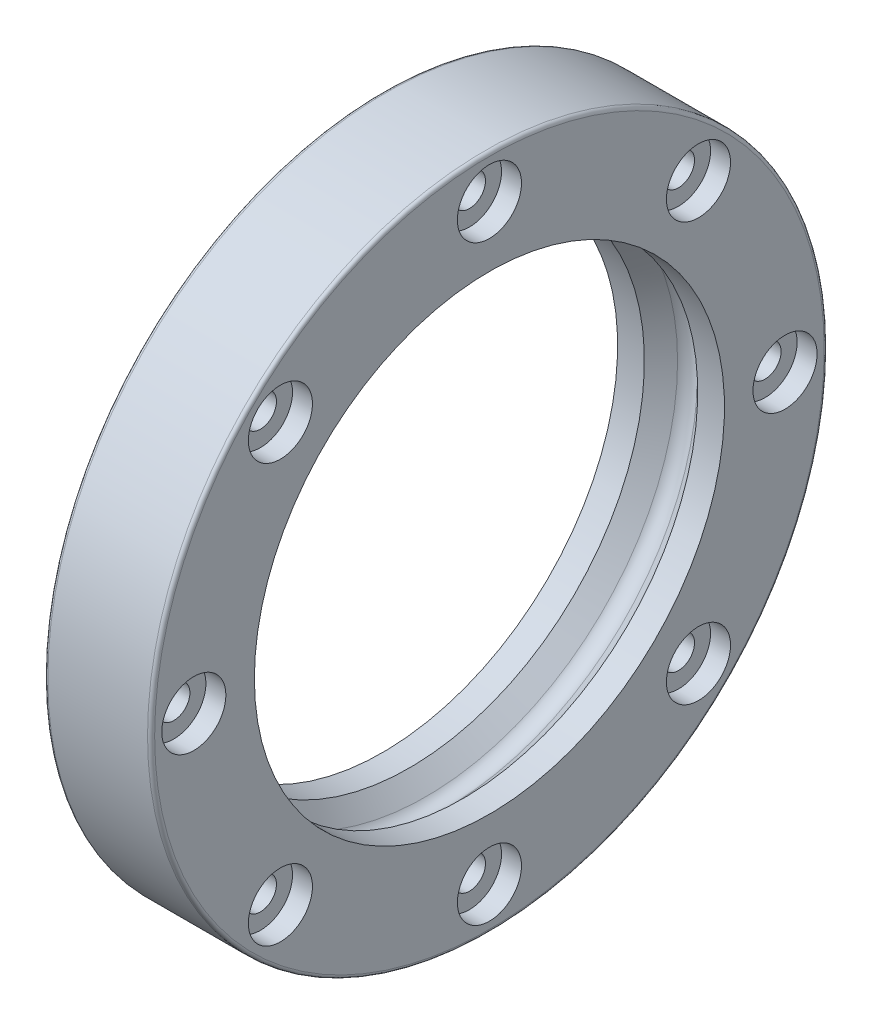
ISO-10303-21;
HEADER;
FILE_DESCRIPTION(('STEP AP214'),'2;1');
FILE_NAME('part.step','',(''),(''),'','','');
FILE_SCHEMA(('AUTOMOTIVE_DESIGN { 1 0 10303 214 1 1 1 1 }'));
ENDSEC;
DATA;
#1=APPLICATION_CONTEXT('core data for automotive mechanical design processes');
#2=APPLICATION_PROTOCOL_DEFINITION('international standard','automotive_design',2000,#1);
#3=PRODUCT_CONTEXT('',#1,'mechanical');
#4=PRODUCT('Part','Part','',(#3));
#5=PRODUCT_RELATED_PRODUCT_CATEGORY('part','',(#4));
#6=PRODUCT_DEFINITION_FORMATION('','',#4);
#7=PRODUCT_DEFINITION_CONTEXT('part definition',#1,'design');
#8=PRODUCT_DEFINITION('design','',#6,#7);
#9=PRODUCT_DEFINITION_SHAPE('','',#8);
#10=(LENGTH_UNIT() NAMED_UNIT(*) SI_UNIT(.MILLI.,.METRE.));
#11=(NAMED_UNIT(*) PLANE_ANGLE_UNIT() SI_UNIT($,.RADIAN.));
#12=(NAMED_UNIT(*) SI_UNIT($,.STERADIAN.) SOLID_ANGLE_UNIT());
#13=UNCERTAINTY_MEASURE_WITH_UNIT(LENGTH_MEASURE(1.E-05),#10,'distance_accuracy_value','');
#14=(GEOMETRIC_REPRESENTATION_CONTEXT(3) GLOBAL_UNCERTAINTY_ASSIGNED_CONTEXT((#13)) GLOBAL_UNIT_ASSIGNED_CONTEXT((#10,
#11,#12)) REPRESENTATION_CONTEXT('',''));
#15=CARTESIAN_POINT('',(0.,0.,0.));
#16=DIRECTION('',(0.,0.,1.));
#17=DIRECTION('',(1.,0.,0.));
#18=AXIS2_PLACEMENT_3D('',#15,#16,#17);
#19=CARTESIAN_POINT('',(0.,0.,0.));
#20=DIRECTION('',(1.,0.,0.));
#21=DIRECTION('',(0.,0.,-1.));
#22=AXIS2_PLACEMENT_3D('',#19,#20,#21);
#23=CONICAL_SURFACE('',#22,36.7426406871193,0.785398163397447);
#24=CARTESIAN_POINT('',(-1.4142135623731,0.,0.));
#25=DIRECTION('',(-1.,0.,0.));
#26=DIRECTION('',(0.,0.,1.));
#27=AXIS2_PLACEMENT_3D('',#24,#25,#26);
#28=CIRCLE('',#27,35.3284271247462);
#29=CARTESIAN_POINT('',(-1.4142135623731,0.,35.3284271247462));
#30=VERTEX_POINT('',#29);
#31=EDGE_CURVE('E54',#30,#30,#28,.F.);
#32=ORIENTED_EDGE('',*,*,#31,.T.);
#33=EDGE_LOOP('',(#32));
#34=FACE_BOUND('',#33,.T.);
#35=CARTESIAN_POINT('',(-3.74264068711929,0.,0.));
#36=DIRECTION('',(-1.,0.,0.));
#37=DIRECTION('',(0.,0.,1.));
#38=AXIS2_PLACEMENT_3D('',#35,#36,#37);
#39=CIRCLE('',#38,33.);
#40=CARTESIAN_POINT('',(-3.74264068711929,0.,33.));
#41=VERTEX_POINT('',#40);
#42=EDGE_CURVE('E69',#41,#41,#39,.T.);
#43=ORIENTED_EDGE('',*,*,#42,.T.);
#44=EDGE_LOOP('',(#43));
#45=FACE_BOUND('',#44,.T.);
#46=ADVANCED_FACE('F34',(#34,#45),#23,.F.);
#47=CARTESIAN_POINT('',(0.,0.,0.));
#48=DIRECTION('',(-1.,0.,0.));
#49=DIRECTION('',(0.,0.,1.));
#50=AXIS2_PLACEMENT_3D('',#47,#48,#49);
#51=CONICAL_SURFACE('',#50,36.7426406871193,0.785398163397449);
#52=CARTESIAN_POINT('',(1.4142135623731,0.,0.));
#53=DIRECTION('',(1.,0.,0.));
#54=DIRECTION('',(0.,0.,-1.));
#55=AXIS2_PLACEMENT_3D('',#52,#53,#54);
#56=CIRCLE('',#55,35.3284271247462);
#57=CARTESIAN_POINT('',(1.4142135623731,0.,-35.3284271247462));
#58=VERTEX_POINT('',#57);
#59=EDGE_CURVE('E57',#58,#58,#56,.F.);
#60=ORIENTED_EDGE('',*,*,#59,.T.);
#61=EDGE_LOOP('',(#60));
#62=FACE_BOUND('',#61,.T.);
#63=CARTESIAN_POINT('',(3.74264068711929,0.,0.));
#64=DIRECTION('',(-1.,0.,0.));
#65=DIRECTION('',(0.,0.,1.));
#66=AXIS2_PLACEMENT_3D('',#63,#64,#65);
#67=CIRCLE('',#66,33.);
#68=CARTESIAN_POINT('',(3.74264068711929,0.,33.));
#69=VERTEX_POINT('',#68);
#70=EDGE_CURVE('E60',#69,#69,#67,.T.);
#71=ORIENTED_EDGE('',*,*,#70,.F.);
#72=EDGE_LOOP('',(#71));
#73=FACE_BOUND('',#72,.T.);
#74=ADVANCED_FACE('F194',(#62,#73),#51,.F.);
#75=CARTESIAN_POINT('',(-33.7322419359837,0.,0.));
#76=DIRECTION('',(-1.,0.,0.));
#77=DIRECTION('',(0.,0.,1.));
#78=AXIS2_PLACEMENT_3D('',#75,#76,#77);
#79=CYLINDRICAL_SURFACE('',#78,33.);
#80=ORIENTED_EDGE('',*,*,#70,.T.);
#81=EDGE_LOOP('',(#80));
#82=FACE_BOUND('',#81,.T.);
#83=CARTESIAN_POINT('',(7.5,0.,0.));
#84=DIRECTION('',(-1.,0.,0.));
#85=DIRECTION('',(0.,0.,1.));
#86=AXIS2_PLACEMENT_3D('',#83,#84,#85);
#87=CIRCLE('',#86,33.);
#88=CARTESIAN_POINT('',(7.5,0.,33.));
#89=VERTEX_POINT('',#88);
#90=EDGE_CURVE('E63',#89,#89,#87,.T.);
#91=ORIENTED_EDGE('',*,*,#90,.F.);
#92=EDGE_LOOP('',(#91));
#93=FACE_BOUND('',#92,.T.);
#94=ADVANCED_FACE('F175',(#82,#93),#79,.F.);
#95=CARTESIAN_POINT('',(7.5,0.,0.));
#96=DIRECTION('',(1.,0.,0.));
#97=DIRECTION('',(0.,0.,-1.));
#98=AXIS2_PLACEMENT_3D('',#95,#96,#97);
#99=PLANE('',#98);
#100=CARTESIAN_POINT('',(7.5,29.3449314192421,29.3449314192414));
#101=DIRECTION('',(1.,0.,0.));
#102=DIRECTION('',(0.,0.,-1.));
#103=AXIS2_PLACEMENT_3D('',#100,#101,#102);
#104=CIRCLE('',#103,4.5);
#105=CARTESIAN_POINT('',(7.5,29.3449314192421,24.8449314192414));
#106=VERTEX_POINT('',#105);
#107=EDGE_CURVE('E165',#106,#106,#104,.T.);
#108=ORIENTED_EDGE('',*,*,#107,.F.);
#109=EDGE_LOOP('',(#108));
#110=FACE_BOUND('',#109,.T.);
#111=CARTESIAN_POINT('',(7.5,4.3468942668597E-13,41.5));
#112=DIRECTION('',(1.,0.,0.));
#113=DIRECTION('',(0.,0.,-1.));
#114=AXIS2_PLACEMENT_3D('',#111,#112,#113);
#115=CIRCLE('',#114,4.5);
#116=CARTESIAN_POINT('',(7.5,4.3468942668597E-13,37.));
#117=VERTEX_POINT('',#116);
#118=EDGE_CURVE('E153',#117,#117,#115,.T.);
#119=ORIENTED_EDGE('',*,*,#118,.F.);
#120=EDGE_LOOP('',(#119));
#121=FACE_BOUND('',#120,.T.);
#122=CARTESIAN_POINT('',(7.5,-29.3449314192415,29.344931419242));
#123=DIRECTION('',(1.,0.,0.));
#124=DIRECTION('',(0.,0.,-1.));
#125=AXIS2_PLACEMENT_3D('',#122,#123,#124);
#126=CIRCLE('',#125,4.5);
#127=CARTESIAN_POINT('',(7.5,-29.3449314192415,24.844931419242));
#128=VERTEX_POINT('',#127);
#129=EDGE_CURVE('E141',#128,#128,#126,.T.);
#130=ORIENTED_EDGE('',*,*,#129,.F.);
#131=EDGE_LOOP('',(#130));
#132=FACE_BOUND('',#131,.T.);
#133=CARTESIAN_POINT('',(7.5,-41.5,0.));
#134=DIRECTION('',(1.,0.,0.));
#135=DIRECTION('',(0.,0.,-1.));
#136=AXIS2_PLACEMENT_3D('',#133,#134,#135);
#137=CIRCLE('',#136,4.5);
#138=CARTESIAN_POINT('',(7.5,-41.5,-4.5));
#139=VERTEX_POINT('',#138);
#140=EDGE_CURVE('E129',#139,#139,#137,.T.);
#141=ORIENTED_EDGE('',*,*,#140,.F.);
#142=EDGE_LOOP('',(#141));
#143=FACE_BOUND('',#142,.T.);
#144=CARTESIAN_POINT('',(7.5,-29.3449314192419,-29.3449314192416));
#145=DIRECTION('',(1.,0.,0.));
#146=DIRECTION('',(0.,0.,-1.));
#147=AXIS2_PLACEMENT_3D('',#144,#145,#146);
#148=CIRCLE('',#147,4.5);
#149=CARTESIAN_POINT('',(7.5,-29.3449314192419,-33.8449314192416));
#150=VERTEX_POINT('',#149);
#151=EDGE_CURVE('E117',#150,#150,#148,.T.);
#152=ORIENTED_EDGE('',*,*,#151,.F.);
#153=EDGE_LOOP('',(#152));
#154=FACE_BOUND('',#153,.T.);
#155=CARTESIAN_POINT('',(7.5,-1.4489647556199E-13,-41.5));
#156=DIRECTION('',(1.,0.,0.));
#157=DIRECTION('',(0.,0.,-1.));
#158=AXIS2_PLACEMENT_3D('',#155,#156,#157);
#159=CIRCLE('',#158,4.5);
#160=CARTESIAN_POINT('',(7.5,-1.4489647556199E-13,-46.));
#161=VERTEX_POINT('',#160);
#162=EDGE_CURVE('E105',#161,#161,#159,.T.);
#163=ORIENTED_EDGE('',*,*,#162,.F.);
#164=EDGE_LOOP('',(#163));
#165=FACE_BOUND('',#164,.T.);
#166=CARTESIAN_POINT('',(7.5,29.3449314192417,-29.3449314192418));
#167=DIRECTION('',(1.,0.,0.));
#168=DIRECTION('',(0.,0.,-1.));
#169=AXIS2_PLACEMENT_3D('',#166,#167,#168);
#170=CIRCLE('',#169,4.5);
#171=CARTESIAN_POINT('',(7.5,29.3449314192417,-33.8449314192418));
#172=VERTEX_POINT('',#171);
#173=EDGE_CURVE('E93',#172,#172,#170,.T.);
#174=ORIENTED_EDGE('',*,*,#173,.F.);
#175=EDGE_LOOP('',(#174));
#176=FACE_BOUND('',#175,.T.);
#177=CARTESIAN_POINT('',(7.5,41.5,0.));
#178=DIRECTION('',(1.,0.,0.));
#179=DIRECTION('',(0.,0.,-1.));
#180=AXIS2_PLACEMENT_3D('',#177,#178,#179);
#181=CIRCLE('',#180,4.5);
#182=CARTESIAN_POINT('',(7.5,41.5,-4.5));
#183=VERTEX_POINT('',#182);
#184=EDGE_CURVE('E81',#183,#183,#181,.T.);
#185=ORIENTED_EDGE('',*,*,#184,.F.);
#186=EDGE_LOOP('',(#185));
#187=FACE_BOUND('',#186,.T.);
#188=CARTESIAN_POINT('',(7.5,0.,0.));
#189=DIRECTION('',(1.,0.,0.));
#190=DIRECTION('',(0.,0.,-1.));
#191=AXIS2_PLACEMENT_3D('',#188,#189,#190);
#192=CIRCLE('',#191,47.);
#193=CARTESIAN_POINT('',(7.5,0.,-47.));
#194=VERTEX_POINT('',#193);
#195=EDGE_CURVE('E41',#194,#194,#192,.T.);
#196=ORIENTED_EDGE('',*,*,#195,.T.);
#197=EDGE_LOOP('',(#196));
#198=FACE_BOUND('',#197,.T.);
#199=ORIENTED_EDGE('',*,*,#90,.T.);
#200=EDGE_LOOP('',(#199));
#201=FACE_BOUND('',#200,.T.);
#202=ADVANCED_FACE('F171',(#110,#121,#132,#143,#154,#165,#176,#187,#198,#201),#99,.T.);
#203=CARTESIAN_POINT('',(-33.7322419359837,0.,0.));
#204=DIRECTION('',(-1.,0.,0.));
#205=DIRECTION('',(0.,0.,1.));
#206=AXIS2_PLACEMENT_3D('',#203,#204,#205);
#207=CYLINDRICAL_SURFACE('',#206,47.5);
#208=CARTESIAN_POINT('',(7.,0.,0.));
#209=DIRECTION('',(1.,0.,0.));
#210=DIRECTION('',(0.,0.,-1.));
#211=AXIS2_PLACEMENT_3D('',#208,#209,#210);
#212=CIRCLE('',#211,47.5);
#213=CARTESIAN_POINT('',(7.,0.,-47.5));
#214=VERTEX_POINT('',#213);
#215=EDGE_CURVE('E45',#214,#214,#212,.F.);
#216=ORIENTED_EDGE('',*,*,#215,.T.);
#217=EDGE_LOOP('',(#216));
#218=FACE_BOUND('',#217,.T.);
#219=CARTESIAN_POINT('',(-7.,0.,0.));
#220=DIRECTION('',(1.,0.,0.));
#221=DIRECTION('',(0.,0.,-1.));
#222=AXIS2_PLACEMENT_3D('',#219,#220,#221);
#223=CIRCLE('',#222,47.5);
#224=CARTESIAN_POINT('',(-7.,0.,-47.5));
#225=VERTEX_POINT('',#224);
#226=EDGE_CURVE('E49',#225,#225,#223,.T.);
#227=ORIENTED_EDGE('',*,*,#226,.T.);
#228=EDGE_LOOP('',(#227));
#229=FACE_BOUND('',#228,.T.);
#230=ADVANCED_FACE('F174',(#218,#229),#207,.T.);
#231=CARTESIAN_POINT('',(-7.5,0.,0.));
#232=DIRECTION('',(1.,0.,0.));
#233=DIRECTION('',(0.,0.,-1.));
#234=AXIS2_PLACEMENT_3D('',#231,#232,#233);
#235=PLANE('',#234);
#236=CARTESIAN_POINT('',(-7.5,29.3449314192421,29.3449314192414));
#237=DIRECTION('',(1.,0.,0.));
#238=DIRECTION('',(0.,0.,-1.));
#239=AXIS2_PLACEMENT_3D('',#236,#237,#238);
#240=CIRCLE('',#239,2.25);
#241=CARTESIAN_POINT('',(-7.5,29.3449314192421,27.0949314192414));
#242=VERTEX_POINT('',#241);
#243=EDGE_CURVE('E156',#242,#242,#240,.T.);
#244=ORIENTED_EDGE('',*,*,#243,.T.);
#245=EDGE_LOOP('',(#244));
#246=FACE_BOUND('',#245,.T.);
#247=CARTESIAN_POINT('',(-7.5,4.3468942668597E-13,41.5));
#248=DIRECTION('',(1.,0.,0.));
#249=DIRECTION('',(0.,0.,-1.));
#250=AXIS2_PLACEMENT_3D('',#247,#248,#249);
#251=CIRCLE('',#250,2.25);
#252=CARTESIAN_POINT('',(-7.5,4.3468942668597E-13,39.25));
#253=VERTEX_POINT('',#252);
#254=EDGE_CURVE('E144',#253,#253,#251,.T.);
#255=ORIENTED_EDGE('',*,*,#254,.T.);
#256=EDGE_LOOP('',(#255));
#257=FACE_BOUND('',#256,.T.);
#258=CARTESIAN_POINT('',(-7.5,-29.3449314192415,29.344931419242));
#259=DIRECTION('',(1.,0.,0.));
#260=DIRECTION('',(0.,0.,-1.));
#261=AXIS2_PLACEMENT_3D('',#258,#259,#260);
#262=CIRCLE('',#261,2.25);
#263=CARTESIAN_POINT('',(-7.5,-29.3449314192415,27.094931419242));
#264=VERTEX_POINT('',#263);
#265=EDGE_CURVE('E132',#264,#264,#262,.T.);
#266=ORIENTED_EDGE('',*,*,#265,.T.);
#267=EDGE_LOOP('',(#266));
#268=FACE_BOUND('',#267,.T.);
#269=CARTESIAN_POINT('',(-7.5,-41.5,0.));
#270=DIRECTION('',(1.,0.,0.));
#271=DIRECTION('',(0.,0.,-1.));
#272=AXIS2_PLACEMENT_3D('',#269,#270,#271);
#273=CIRCLE('',#272,2.25);
#274=CARTESIAN_POINT('',(-7.5,-41.5,-2.25));
#275=VERTEX_POINT('',#274);
#276=EDGE_CURVE('E120',#275,#275,#273,.T.);
#277=ORIENTED_EDGE('',*,*,#276,.T.);
#278=EDGE_LOOP('',(#277));
#279=FACE_BOUND('',#278,.T.);
#280=CARTESIAN_POINT('',(-7.5,-29.3449314192419,-29.3449314192416));
#281=DIRECTION('',(1.,0.,0.));
#282=DIRECTION('',(0.,0.,-1.));
#283=AXIS2_PLACEMENT_3D('',#280,#281,#282);
#284=CIRCLE('',#283,2.25);
#285=CARTESIAN_POINT('',(-7.5,-29.3449314192419,-31.5949314192416));
#286=VERTEX_POINT('',#285);
#287=EDGE_CURVE('E108',#286,#286,#284,.T.);
#288=ORIENTED_EDGE('',*,*,#287,.T.);
#289=EDGE_LOOP('',(#288));
#290=FACE_BOUND('',#289,.T.);
#291=CARTESIAN_POINT('',(-7.5,-1.4489647556199E-13,-41.5));
#292=DIRECTION('',(1.,0.,0.));
#293=DIRECTION('',(0.,0.,-1.));
#294=AXIS2_PLACEMENT_3D('',#291,#292,#293);
#295=CIRCLE('',#294,2.25);
#296=CARTESIAN_POINT('',(-7.5,-1.4489647556199E-13,-43.75));
#297=VERTEX_POINT('',#296);
#298=EDGE_CURVE('E96',#297,#297,#295,.T.);
#299=ORIENTED_EDGE('',*,*,#298,.T.);
#300=EDGE_LOOP('',(#299));
#301=FACE_BOUND('',#300,.T.);
#302=CARTESIAN_POINT('',(-7.5,29.3449314192417,-29.3449314192418));
#303=DIRECTION('',(1.,0.,0.));
#304=DIRECTION('',(0.,0.,-1.));
#305=AXIS2_PLACEMENT_3D('',#302,#303,#304);
#306=CIRCLE('',#305,2.25);
#307=CARTESIAN_POINT('',(-7.5,29.3449314192417,-31.5949314192418));
#308=VERTEX_POINT('',#307);
#309=EDGE_CURVE('E84',#308,#308,#306,.T.);
#310=ORIENTED_EDGE('',*,*,#309,.T.);
#311=EDGE_LOOP('',(#310));
#312=FACE_BOUND('',#311,.T.);
#313=CARTESIAN_POINT('',(-7.5,41.5,0.));
#314=DIRECTION('',(1.,0.,0.));
#315=DIRECTION('',(0.,0.,-1.));
#316=AXIS2_PLACEMENT_3D('',#313,#314,#315);
#317=CIRCLE('',#316,2.25);
#318=CARTESIAN_POINT('',(-7.5,41.5,-2.25));
#319=VERTEX_POINT('',#318);
#320=EDGE_CURVE('E72',#319,#319,#317,.T.);
#321=ORIENTED_EDGE('',*,*,#320,.T.);
#322=EDGE_LOOP('',(#321));
#323=FACE_BOUND('',#322,.T.);
#324=CARTESIAN_POINT('',(-7.5,0.,0.));
#325=DIRECTION('',(1.,0.,0.));
#326=DIRECTION('',(0.,0.,-1.));
#327=AXIS2_PLACEMENT_3D('',#324,#325,#326);
#328=CIRCLE('',#327,47.);
#329=CARTESIAN_POINT('',(-7.5,0.,-47.));
#330=VERTEX_POINT('',#329);
#331=EDGE_CURVE('E10',#330,#330,#328,.F.);
#332=ORIENTED_EDGE('',*,*,#331,.T.);
#333=EDGE_LOOP('',(#332));
#334=FACE_BOUND('',#333,.T.);
#335=CARTESIAN_POINT('',(-7.5,0.,0.));
#336=DIRECTION('',(-1.,0.,0.));
#337=DIRECTION('',(0.,0.,1.));
#338=AXIS2_PLACEMENT_3D('',#335,#336,#337);
#339=CIRCLE('',#338,33.);
#340=CARTESIAN_POINT('',(-7.5,0.,33.));
#341=VERTEX_POINT('',#340);
#342=EDGE_CURVE('E66',#341,#341,#339,.T.);
#343=ORIENTED_EDGE('',*,*,#342,.F.);
#344=EDGE_LOOP('',(#343));
#345=FACE_BOUND('',#344,.T.);
#346=ADVANCED_FACE('F209',(#246,#257,#268,#279,#290,#301,#312,#323,#334,#345),#235,.F.);
#347=ORIENTED_EDGE('',*,*,#342,.T.);
#348=EDGE_LOOP('',(#347));
#349=FACE_BOUND('',#348,.T.);
#350=ORIENTED_EDGE('',*,*,#42,.F.);
#351=EDGE_LOOP('',(#350));
#352=FACE_BOUND('',#351,.T.);
#353=ADVANCED_FACE('F197',(#349,#352),#79,.F.);
#354=CARTESIAN_POINT('',(0.,0.,0.));
#355=DIRECTION('',(-1.,0.,0.));
#356=DIRECTION('',(0.,0.,1.));
#357=AXIS2_PLACEMENT_3D('',#354,#355,#356);
#358=TOROIDAL_SURFACE('',#357,33.9142135623731,2.);
#359=ORIENTED_EDGE('',*,*,#31,.F.);
#360=EDGE_LOOP('',(#359));
#361=FACE_BOUND('',#360,.T.);
#362=ORIENTED_EDGE('',*,*,#59,.F.);
#363=EDGE_LOOP('',(#362));
#364=FACE_BOUND('',#363,.T.);
#365=ADVANCED_FACE('F208',(#361,#364),#358,.F.);
#366=CARTESIAN_POINT('',(7.,0.,0.));
#367=DIRECTION('',(1.,0.,0.));
#368=DIRECTION('',(0.,0.,-1.));
#369=AXIS2_PLACEMENT_3D('',#366,#367,#368);
#370=TOROIDAL_SURFACE('',#369,47.,0.5);
#371=ORIENTED_EDGE('',*,*,#195,.F.);
#372=EDGE_LOOP('',(#371));
#373=FACE_BOUND('',#372,.T.);
#374=ORIENTED_EDGE('',*,*,#215,.F.);
#375=EDGE_LOOP('',(#374));
#376=FACE_BOUND('',#375,.T.);
#377=ADVANCED_FACE('F220',(#373,#376),#370,.T.);
#378=CARTESIAN_POINT('',(-7.,0.,0.));
#379=DIRECTION('',(1.,0.,0.));
#380=DIRECTION('',(0.,0.,-1.));
#381=AXIS2_PLACEMENT_3D('',#378,#379,#380);
#382=TOROIDAL_SURFACE('',#381,47.,0.5);
#383=ORIENTED_EDGE('',*,*,#226,.F.);
#384=EDGE_LOOP('',(#383));
#385=FACE_BOUND('',#384,.T.);
#386=ORIENTED_EDGE('',*,*,#331,.F.);
#387=EDGE_LOOP('',(#386));
#388=FACE_BOUND('',#387,.T.);
#389=ADVANCED_FACE('F36',(#385,#388),#382,.T.);
#390=CARTESIAN_POINT('',(7.5,41.5,0.));
#391=DIRECTION('',(1.,0.,0.));
#392=DIRECTION('',(0.,0.,-1.));
#393=AXIS2_PLACEMENT_3D('',#390,#391,#392);
#394=CYLINDRICAL_SURFACE('',#393,2.25);
#395=ORIENTED_EDGE('',*,*,#320,.F.);
#396=EDGE_LOOP('',(#395));
#397=FACE_BOUND('',#396,.T.);
#398=CARTESIAN_POINT('',(4.7,41.5,0.));
#399=DIRECTION('',(1.,0.,0.));
#400=DIRECTION('',(0.,0.,-1.));
#401=AXIS2_PLACEMENT_3D('',#398,#399,#400);
#402=CIRCLE('',#401,2.25);
#403=CARTESIAN_POINT('',(4.7,41.5,-2.25));
#404=VERTEX_POINT('',#403);
#405=EDGE_CURVE('E75',#404,#404,#402,.T.);
#406=ORIENTED_EDGE('',*,*,#405,.T.);
#407=EDGE_LOOP('',(#406));
#408=FACE_BOUND('',#407,.T.);
#409=ADVANCED_FACE('F227',(#397,#408),#394,.F.);
#410=CARTESIAN_POINT('',(4.7,43.75,0.));
#411=DIRECTION('',(-1.,0.,0.));
#412=DIRECTION('',(0.,0.,1.));
#413=AXIS2_PLACEMENT_3D('',#410,#411,#412);
#414=PLANE('',#413);
#415=ORIENTED_EDGE('',*,*,#405,.F.);
#416=EDGE_LOOP('',(#415));
#417=FACE_BOUND('',#416,.T.);
#418=CARTESIAN_POINT('',(4.7,41.5,0.));
#419=DIRECTION('',(1.,0.,0.));
#420=DIRECTION('',(0.,0.,-1.));
#421=AXIS2_PLACEMENT_3D('',#418,#419,#420);
#422=CIRCLE('',#421,4.5);
#423=CARTESIAN_POINT('',(4.7,41.5,-4.5));
#424=VERTEX_POINT('',#423);
#425=EDGE_CURVE('E78',#424,#424,#422,.T.);
#426=ORIENTED_EDGE('',*,*,#425,.T.);
#427=EDGE_LOOP('',(#426));
#428=FACE_BOUND('',#427,.T.);
#429=ADVANCED_FACE('F267',(#417,#428),#414,.F.);
#430=CARTESIAN_POINT('',(7.5,41.5,0.));
#431=DIRECTION('',(1.,0.,0.));
#432=DIRECTION('',(0.,0.,-1.));
#433=AXIS2_PLACEMENT_3D('',#430,#431,#432);
#434=CYLINDRICAL_SURFACE('',#433,4.5);
#435=ORIENTED_EDGE('',*,*,#425,.F.);
#436=EDGE_LOOP('',(#435));
#437=FACE_BOUND('',#436,.T.);
#438=ORIENTED_EDGE('',*,*,#184,.T.);
#439=EDGE_LOOP('',(#438));
#440=FACE_BOUND('',#439,.T.);
#441=ADVANCED_FACE('F272',(#437,#440),#434,.F.);
#442=CARTESIAN_POINT('',(7.5,29.3449314192417,-29.3449314192418));
#443=DIRECTION('',(1.,0.,0.));
#444=DIRECTION('',(0.,0.,-1.));
#445=AXIS2_PLACEMENT_3D('',#442,#443,#444);
#446=CYLINDRICAL_SURFACE('',#445,2.25);
#447=ORIENTED_EDGE('',*,*,#309,.F.);
#448=EDGE_LOOP('',(#447));
#449=FACE_BOUND('',#448,.T.);
#450=CARTESIAN_POINT('',(4.7,29.3449314192417,-29.3449314192418));
#451=DIRECTION('',(1.,0.,0.));
#452=DIRECTION('',(0.,0.,-1.));
#453=AXIS2_PLACEMENT_3D('',#450,#451,#452);
#454=CIRCLE('',#453,2.25);
#455=CARTESIAN_POINT('',(4.7,29.3449314192417,-31.5949314192418));
#456=VERTEX_POINT('',#455);
#457=EDGE_CURVE('E87',#456,#456,#454,.T.);
#458=ORIENTED_EDGE('',*,*,#457,.T.);
#459=EDGE_LOOP('',(#458));
#460=FACE_BOUND('',#459,.T.);
#461=ADVANCED_FACE('F278',(#449,#460),#446,.F.);
#462=CARTESIAN_POINT('',(4.7,31.5949314192417,-29.3449314192418));
#463=DIRECTION('',(-1.,0.,0.));
#464=DIRECTION('',(0.,0.,1.));
#465=AXIS2_PLACEMENT_3D('',#462,#463,#464);
#466=PLANE('',#465);
#467=ORIENTED_EDGE('',*,*,#457,.F.);
#468=EDGE_LOOP('',(#467));
#469=FACE_BOUND('',#468,.T.);
#470=CARTESIAN_POINT('',(4.7,29.3449314192417,-29.3449314192418));
#471=DIRECTION('',(1.,0.,0.));
#472=DIRECTION('',(0.,0.,-1.));
#473=AXIS2_PLACEMENT_3D('',#470,#471,#472);
#474=CIRCLE('',#473,4.5);
#475=CARTESIAN_POINT('',(4.7,29.3449314192417,-33.8449314192418));
#476=VERTEX_POINT('',#475);
#477=EDGE_CURVE('E90',#476,#476,#474,.T.);
#478=ORIENTED_EDGE('',*,*,#477,.T.);
#479=EDGE_LOOP('',(#478));
#480=FACE_BOUND('',#479,.T.);
#481=ADVANCED_FACE('F283',(#469,#480),#466,.F.);
#482=CARTESIAN_POINT('',(7.5,29.3449314192417,-29.3449314192418));
#483=DIRECTION('',(1.,0.,0.));
#484=DIRECTION('',(0.,0.,-1.));
#485=AXIS2_PLACEMENT_3D('',#482,#483,#484);
#486=CYLINDRICAL_SURFACE('',#485,4.5);
#487=ORIENTED_EDGE('',*,*,#477,.F.);
#488=EDGE_LOOP('',(#487));
#489=FACE_BOUND('',#488,.T.);
#490=ORIENTED_EDGE('',*,*,#173,.T.);
#491=EDGE_LOOP('',(#490));
#492=FACE_BOUND('',#491,.T.);
#493=ADVANCED_FACE('F289',(#489,#492),#486,.F.);
#494=CARTESIAN_POINT('',(7.5,-1.4489647556199E-13,-41.5));
#495=DIRECTION('',(1.,0.,0.));
#496=DIRECTION('',(0.,0.,-1.));
#497=AXIS2_PLACEMENT_3D('',#494,#495,#496);
#498=CYLINDRICAL_SURFACE('',#497,2.25);
#499=ORIENTED_EDGE('',*,*,#298,.F.);
#500=EDGE_LOOP('',(#499));
#501=FACE_BOUND('',#500,.T.);
#502=CARTESIAN_POINT('',(4.7,-1.4489647556199E-13,-41.5));
#503=DIRECTION('',(1.,0.,0.));
#504=DIRECTION('',(0.,0.,-1.));
#505=AXIS2_PLACEMENT_3D('',#502,#503,#504);
#506=CIRCLE('',#505,2.25);
#507=CARTESIAN_POINT('',(4.7,-1.4489647556199E-13,-43.75));
#508=VERTEX_POINT('',#507);
#509=EDGE_CURVE('E99',#508,#508,#506,.T.);
#510=ORIENTED_EDGE('',*,*,#509,.T.);
#511=EDGE_LOOP('',(#510));
#512=FACE_BOUND('',#511,.T.);
#513=ADVANCED_FACE('F293',(#501,#512),#498,.F.);
#514=CARTESIAN_POINT('',(4.7,2.24999999999986,-41.5));
#515=DIRECTION('',(-1.,0.,0.));
#516=DIRECTION('',(0.,0.,1.));
#517=AXIS2_PLACEMENT_3D('',#514,#515,#516);
#518=PLANE('',#517);
#519=ORIENTED_EDGE('',*,*,#509,.F.);
#520=EDGE_LOOP('',(#519));
#521=FACE_BOUND('',#520,.T.);
#522=CARTESIAN_POINT('',(4.7,-1.4489647556199E-13,-41.5));
#523=DIRECTION('',(1.,0.,0.));
#524=DIRECTION('',(0.,0.,-1.));
#525=AXIS2_PLACEMENT_3D('',#522,#523,#524);
#526=CIRCLE('',#525,4.5);
#527=CARTESIAN_POINT('',(4.7,-1.4489647556199E-13,-46.));
#528=VERTEX_POINT('',#527);
#529=EDGE_CURVE('E102',#528,#528,#526,.T.);
#530=ORIENTED_EDGE('',*,*,#529,.T.);
#531=EDGE_LOOP('',(#530));
#532=FACE_BOUND('',#531,.T.);
#533=ADVANCED_FACE('F297',(#521,#532),#518,.F.);
#534=CARTESIAN_POINT('',(7.5,-1.4489647556199E-13,-41.5));
#535=DIRECTION('',(1.,0.,0.));
#536=DIRECTION('',(0.,0.,-1.));
#537=AXIS2_PLACEMENT_3D('',#534,#535,#536);
#538=CYLINDRICAL_SURFACE('',#537,4.5);
#539=ORIENTED_EDGE('',*,*,#529,.F.);
#540=EDGE_LOOP('',(#539));
#541=FACE_BOUND('',#540,.T.);
#542=ORIENTED_EDGE('',*,*,#162,.T.);
#543=EDGE_LOOP('',(#542));
#544=FACE_BOUND('',#543,.T.);
#545=ADVANCED_FACE('F301',(#541,#544),#538,.F.);
#546=CARTESIAN_POINT('',(7.5,-29.3449314192419,-29.3449314192416));
#547=DIRECTION('',(1.,0.,0.));
#548=DIRECTION('',(0.,0.,-1.));
#549=AXIS2_PLACEMENT_3D('',#546,#547,#548);
#550=CYLINDRICAL_SURFACE('',#549,2.25);
#551=ORIENTED_EDGE('',*,*,#287,.F.);
#552=EDGE_LOOP('',(#551));
#553=FACE_BOUND('',#552,.T.);
#554=CARTESIAN_POINT('',(4.7,-29.3449314192419,-29.3449314192416));
#555=DIRECTION('',(1.,0.,0.));
#556=DIRECTION('',(0.,0.,-1.));
#557=AXIS2_PLACEMENT_3D('',#554,#555,#556);
#558=CIRCLE('',#557,2.25);
#559=CARTESIAN_POINT('',(4.7,-29.3449314192419,-31.5949314192416));
#560=VERTEX_POINT('',#559);
#561=EDGE_CURVE('E111',#560,#560,#558,.T.);
#562=ORIENTED_EDGE('',*,*,#561,.T.);
#563=EDGE_LOOP('',(#562));
#564=FACE_BOUND('',#563,.T.);
#565=ADVANCED_FACE('F305',(#553,#564),#550,.F.);
#566=CARTESIAN_POINT('',(4.7,-27.0949314192419,-29.3449314192416));
#567=DIRECTION('',(-1.,0.,0.));
#568=DIRECTION('',(0.,0.,1.));
#569=AXIS2_PLACEMENT_3D('',#566,#567,#568);
#570=PLANE('',#569);
#571=ORIENTED_EDGE('',*,*,#561,.F.);
#572=EDGE_LOOP('',(#571));
#573=FACE_BOUND('',#572,.T.);
#574=CARTESIAN_POINT('',(4.7,-29.3449314192419,-29.3449314192416));
#575=DIRECTION('',(1.,0.,0.));
#576=DIRECTION('',(0.,0.,-1.));
#577=AXIS2_PLACEMENT_3D('',#574,#575,#576);
#578=CIRCLE('',#577,4.5);
#579=CARTESIAN_POINT('',(4.7,-29.3449314192419,-33.8449314192416));
#580=VERTEX_POINT('',#579);
#581=EDGE_CURVE('E114',#580,#580,#578,.T.);
#582=ORIENTED_EDGE('',*,*,#581,.T.);
#583=EDGE_LOOP('',(#582));
#584=FACE_BOUND('',#583,.T.);
#585=ADVANCED_FACE('F309',(#573,#584),#570,.F.);
#586=CARTESIAN_POINT('',(7.5,-29.3449314192419,-29.3449314192416));
#587=DIRECTION('',(1.,0.,0.));
#588=DIRECTION('',(0.,0.,-1.));
#589=AXIS2_PLACEMENT_3D('',#586,#587,#588);
#590=CYLINDRICAL_SURFACE('',#589,4.5);
#591=ORIENTED_EDGE('',*,*,#581,.F.);
#592=EDGE_LOOP('',(#591));
#593=FACE_BOUND('',#592,.T.);
#594=ORIENTED_EDGE('',*,*,#151,.T.);
#595=EDGE_LOOP('',(#594));
#596=FACE_BOUND('',#595,.T.);
#597=ADVANCED_FACE('F313',(#593,#596),#590,.F.);
#598=CARTESIAN_POINT('',(7.5,-41.5,0.));
#599=DIRECTION('',(1.,0.,0.));
#600=DIRECTION('',(0.,0.,-1.));
#601=AXIS2_PLACEMENT_3D('',#598,#599,#600);
#602=CYLINDRICAL_SURFACE('',#601,2.25);
#603=ORIENTED_EDGE('',*,*,#276,.F.);
#604=EDGE_LOOP('',(#603));
#605=FACE_BOUND('',#604,.T.);
#606=CARTESIAN_POINT('',(4.7,-41.5,0.));
#607=DIRECTION('',(1.,0.,0.));
#608=DIRECTION('',(0.,0.,-1.));
#609=AXIS2_PLACEMENT_3D('',#606,#607,#608);
#610=CIRCLE('',#609,2.25);
#611=CARTESIAN_POINT('',(4.7,-41.5,-2.25));
#612=VERTEX_POINT('',#611);
#613=EDGE_CURVE('E123',#612,#612,#610,.T.);
#614=ORIENTED_EDGE('',*,*,#613,.T.);
#615=EDGE_LOOP('',(#614));
#616=FACE_BOUND('',#615,.T.);
#617=ADVANCED_FACE('F317',(#605,#616),#602,.F.);
#618=CARTESIAN_POINT('',(4.7,-39.25,0.));
#619=DIRECTION('',(-1.,0.,0.));
#620=DIRECTION('',(0.,0.,1.));
#621=AXIS2_PLACEMENT_3D('',#618,#619,#620);
#622=PLANE('',#621);
#623=ORIENTED_EDGE('',*,*,#613,.F.);
#624=EDGE_LOOP('',(#623));
#625=FACE_BOUND('',#624,.T.);
#626=CARTESIAN_POINT('',(4.7,-41.5,0.));
#627=DIRECTION('',(1.,0.,0.));
#628=DIRECTION('',(0.,0.,-1.));
#629=AXIS2_PLACEMENT_3D('',#626,#627,#628);
#630=CIRCLE('',#629,4.5);
#631=CARTESIAN_POINT('',(4.7,-41.5,-4.5));
#632=VERTEX_POINT('',#631);
#633=EDGE_CURVE('E126',#632,#632,#630,.T.);
#634=ORIENTED_EDGE('',*,*,#633,.T.);
#635=EDGE_LOOP('',(#634));
#636=FACE_BOUND('',#635,.T.);
#637=ADVANCED_FACE('F321',(#625,#636),#622,.F.);
#638=CARTESIAN_POINT('',(7.5,-41.5,0.));
#639=DIRECTION('',(1.,0.,0.));
#640=DIRECTION('',(0.,0.,-1.));
#641=AXIS2_PLACEMENT_3D('',#638,#639,#640);
#642=CYLINDRICAL_SURFACE('',#641,4.5);
#643=ORIENTED_EDGE('',*,*,#633,.F.);
#644=EDGE_LOOP('',(#643));
#645=FACE_BOUND('',#644,.T.);
#646=ORIENTED_EDGE('',*,*,#140,.T.);
#647=EDGE_LOOP('',(#646));
#648=FACE_BOUND('',#647,.T.);
#649=ADVANCED_FACE('F325',(#645,#648),#642,.F.);
#650=CARTESIAN_POINT('',(7.5,-29.3449314192415,29.344931419242));
#651=DIRECTION('',(1.,0.,0.));
#652=DIRECTION('',(0.,0.,-1.));
#653=AXIS2_PLACEMENT_3D('',#650,#651,#652);
#654=CYLINDRICAL_SURFACE('',#653,2.25);
#655=ORIENTED_EDGE('',*,*,#265,.F.);
#656=EDGE_LOOP('',(#655));
#657=FACE_BOUND('',#656,.T.);
#658=CARTESIAN_POINT('',(4.7,-29.3449314192415,29.344931419242));
#659=DIRECTION('',(1.,0.,0.));
#660=DIRECTION('',(0.,0.,-1.));
#661=AXIS2_PLACEMENT_3D('',#658,#659,#660);
#662=CIRCLE('',#661,2.25);
#663=CARTESIAN_POINT('',(4.7,-29.3449314192415,27.094931419242));
#664=VERTEX_POINT('',#663);
#665=EDGE_CURVE('E135',#664,#664,#662,.T.);
#666=ORIENTED_EDGE('',*,*,#665,.T.);
#667=EDGE_LOOP('',(#666));
#668=FACE_BOUND('',#667,.T.);
#669=ADVANCED_FACE('F329',(#657,#668),#654,.F.);
#670=CARTESIAN_POINT('',(4.7,-27.0949314192415,29.344931419242));
#671=DIRECTION('',(-1.,0.,0.));
#672=DIRECTION('',(0.,0.,1.));
#673=AXIS2_PLACEMENT_3D('',#670,#671,#672);
#674=PLANE('',#673);
#675=ORIENTED_EDGE('',*,*,#665,.F.);
#676=EDGE_LOOP('',(#675));
#677=FACE_BOUND('',#676,.T.);
#678=CARTESIAN_POINT('',(4.7,-29.3449314192415,29.344931419242));
#679=DIRECTION('',(1.,0.,0.));
#680=DIRECTION('',(0.,0.,-1.));
#681=AXIS2_PLACEMENT_3D('',#678,#679,#680);
#682=CIRCLE('',#681,4.5);
#683=CARTESIAN_POINT('',(4.7,-29.3449314192415,24.844931419242));
#684=VERTEX_POINT('',#683);
#685=EDGE_CURVE('E138',#684,#684,#682,.T.);
#686=ORIENTED_EDGE('',*,*,#685,.T.);
#687=EDGE_LOOP('',(#686));
#688=FACE_BOUND('',#687,.T.);
#689=ADVANCED_FACE('F333',(#677,#688),#674,.F.);
#690=CARTESIAN_POINT('',(7.5,-29.3449314192415,29.344931419242));
#691=DIRECTION('',(1.,0.,0.));
#692=DIRECTION('',(0.,0.,-1.));
#693=AXIS2_PLACEMENT_3D('',#690,#691,#692);
#694=CYLINDRICAL_SURFACE('',#693,4.5);
#695=ORIENTED_EDGE('',*,*,#685,.F.);
#696=EDGE_LOOP('',(#695));
#697=FACE_BOUND('',#696,.T.);
#698=ORIENTED_EDGE('',*,*,#129,.T.);
#699=EDGE_LOOP('',(#698));
#700=FACE_BOUND('',#699,.T.);
#701=ADVANCED_FACE('F337',(#697,#700),#694,.F.);
#702=CARTESIAN_POINT('',(7.5,4.3468942668597E-13,41.5));
#703=DIRECTION('',(1.,0.,0.));
#704=DIRECTION('',(0.,0.,-1.));
#705=AXIS2_PLACEMENT_3D('',#702,#703,#704);
#706=CYLINDRICAL_SURFACE('',#705,2.25);
#707=ORIENTED_EDGE('',*,*,#254,.F.);
#708=EDGE_LOOP('',(#707));
#709=FACE_BOUND('',#708,.T.);
#710=CARTESIAN_POINT('',(4.7,4.3468942668597E-13,41.5));
#711=DIRECTION('',(1.,0.,0.));
#712=DIRECTION('',(0.,0.,-1.));
#713=AXIS2_PLACEMENT_3D('',#710,#711,#712);
#714=CIRCLE('',#713,2.25);
#715=CARTESIAN_POINT('',(4.7,4.3468942668597E-13,39.25));
#716=VERTEX_POINT('',#715);
#717=EDGE_CURVE('E147',#716,#716,#714,.T.);
#718=ORIENTED_EDGE('',*,*,#717,.T.);
#719=EDGE_LOOP('',(#718));
#720=FACE_BOUND('',#719,.T.);
#721=ADVANCED_FACE('F341',(#709,#720),#706,.F.);
#722=CARTESIAN_POINT('',(4.7,2.25000000000044,41.5));
#723=DIRECTION('',(-1.,0.,0.));
#724=DIRECTION('',(0.,0.,1.));
#725=AXIS2_PLACEMENT_3D('',#722,#723,#724);
#726=PLANE('',#725);
#727=ORIENTED_EDGE('',*,*,#717,.F.);
#728=EDGE_LOOP('',(#727));
#729=FACE_BOUND('',#728,.T.);
#730=CARTESIAN_POINT('',(4.7,4.3468942668597E-13,41.5));
#731=DIRECTION('',(1.,0.,0.));
#732=DIRECTION('',(0.,0.,-1.));
#733=AXIS2_PLACEMENT_3D('',#730,#731,#732);
#734=CIRCLE('',#733,4.5);
#735=CARTESIAN_POINT('',(4.7,4.3468942668597E-13,37.));
#736=VERTEX_POINT('',#735);
#737=EDGE_CURVE('E150',#736,#736,#734,.T.);
#738=ORIENTED_EDGE('',*,*,#737,.T.);
#739=EDGE_LOOP('',(#738));
#740=FACE_BOUND('',#739,.T.);
#741=ADVANCED_FACE('F345',(#729,#740),#726,.F.);
#742=CARTESIAN_POINT('',(7.5,4.3468942668597E-13,41.5));
#743=DIRECTION('',(1.,0.,0.));
#744=DIRECTION('',(0.,0.,-1.));
#745=AXIS2_PLACEMENT_3D('',#742,#743,#744);
#746=CYLINDRICAL_SURFACE('',#745,4.5);
#747=ORIENTED_EDGE('',*,*,#737,.F.);
#748=EDGE_LOOP('',(#747));
#749=FACE_BOUND('',#748,.T.);
#750=ORIENTED_EDGE('',*,*,#118,.T.);
#751=EDGE_LOOP('',(#750));
#752=FACE_BOUND('',#751,.T.);
#753=ADVANCED_FACE('F349',(#749,#752),#746,.F.);
#754=CARTESIAN_POINT('',(7.5,29.3449314192421,29.3449314192414));
#755=DIRECTION('',(1.,0.,0.));
#756=DIRECTION('',(0.,0.,-1.));
#757=AXIS2_PLACEMENT_3D('',#754,#755,#756);
#758=CYLINDRICAL_SURFACE('',#757,2.25);
#759=ORIENTED_EDGE('',*,*,#243,.F.);
#760=EDGE_LOOP('',(#759));
#761=FACE_BOUND('',#760,.T.);
#762=CARTESIAN_POINT('',(4.7,29.3449314192421,29.3449314192414));
#763=DIRECTION('',(1.,0.,0.));
#764=DIRECTION('',(0.,0.,-1.));
#765=AXIS2_PLACEMENT_3D('',#762,#763,#764);
#766=CIRCLE('',#765,2.25000000000001);
#767=CARTESIAN_POINT('',(4.7,29.3449314192421,27.0949314192414));
#768=VERTEX_POINT('',#767);
#769=EDGE_CURVE('E159',#768,#768,#766,.T.);
#770=ORIENTED_EDGE('',*,*,#769,.T.);
#771=EDGE_LOOP('',(#770));
#772=FACE_BOUND('',#771,.T.);
#773=ADVANCED_FACE('F353',(#761,#772),#758,.F.);
#774=CARTESIAN_POINT('',(4.7,31.5949314192421,29.3449314192414));
#775=DIRECTION('',(-1.,0.,0.));
#776=DIRECTION('',(0.,0.,1.));
#777=AXIS2_PLACEMENT_3D('',#774,#775,#776);
#778=PLANE('',#777);
#779=ORIENTED_EDGE('',*,*,#769,.F.);
#780=EDGE_LOOP('',(#779));
#781=FACE_BOUND('',#780,.T.);
#782=CARTESIAN_POINT('',(4.7,29.3449314192421,29.3449314192414));
#783=DIRECTION('',(1.,0.,0.));
#784=DIRECTION('',(0.,0.,-1.));
#785=AXIS2_PLACEMENT_3D('',#782,#783,#784);
#786=CIRCLE('',#785,4.5);
#787=CARTESIAN_POINT('',(4.7,29.3449314192421,24.8449314192414));
#788=VERTEX_POINT('',#787);
#789=EDGE_CURVE('E162',#788,#788,#786,.T.);
#790=ORIENTED_EDGE('',*,*,#789,.T.);
#791=EDGE_LOOP('',(#790));
#792=FACE_BOUND('',#791,.T.);
#793=ADVANCED_FACE('F357',(#781,#792),#778,.F.);
#794=CARTESIAN_POINT('',(7.5,29.3449314192421,29.3449314192414));
#795=DIRECTION('',(1.,0.,0.));
#796=DIRECTION('',(0.,0.,-1.));
#797=AXIS2_PLACEMENT_3D('',#794,#795,#796);
#798=CYLINDRICAL_SURFACE('',#797,4.5);
#799=ORIENTED_EDGE('',*,*,#789,.F.);
#800=EDGE_LOOP('',(#799));
#801=FACE_BOUND('',#800,.T.);
#802=ORIENTED_EDGE('',*,*,#107,.T.);
#803=EDGE_LOOP('',(#802));
#804=FACE_BOUND('',#803,.T.);
#805=ADVANCED_FACE('F169',(#801,#804),#798,.F.);
#806=CLOSED_SHELL('',(#46,#74,#94,#202,#230,#346,#353,#365,#377,#389,#409,#429,#441,#461,#481,
#493,#513,#533,#545,#565,#585,#597,#617,#637,#649,#669,#689,#701,#721,#741,#753,#773,#793,#805));
#807=MANIFOLD_SOLID_BREP('B2',#806);
#808=ADVANCED_BREP_SHAPE_REPRESENTATION('',(#18,#807),#14);
#809=SHAPE_DEFINITION_REPRESENTATION(#9,#808);
ENDSEC;
END-ISO-10303-21;
